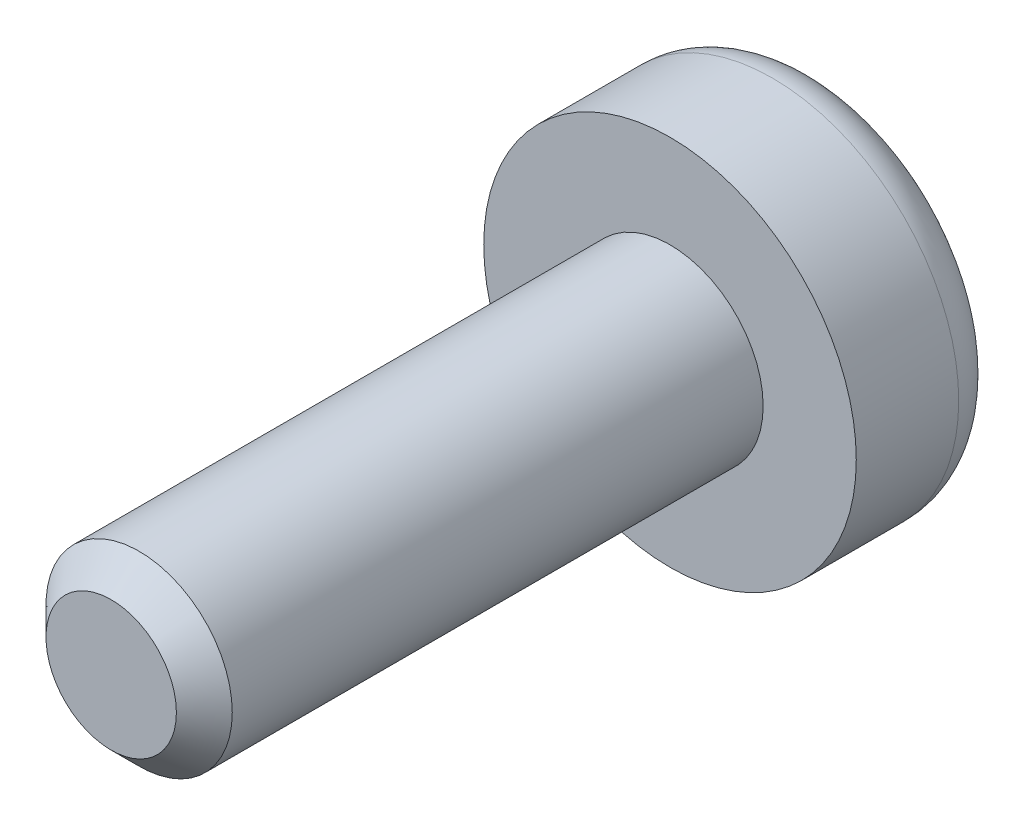
ISO-10303-21;
HEADER;
FILE_DESCRIPTION(('STEP AP214'),'2;1');
FILE_NAME('part.step','',(''),(''),'','','');
FILE_SCHEMA(('AUTOMOTIVE_DESIGN { 1 0 10303 214 1 1 1 1 }'));
ENDSEC;
DATA;
#1=APPLICATION_CONTEXT('core data for automotive mechanical design processes');
#2=APPLICATION_PROTOCOL_DEFINITION('international standard','automotive_design',2000,#1);
#3=PRODUCT_CONTEXT('',#1,'mechanical');
#4=PRODUCT('Part','Part','',(#3));
#5=PRODUCT_RELATED_PRODUCT_CATEGORY('part','',(#4));
#6=PRODUCT_DEFINITION_FORMATION('','',#4);
#7=PRODUCT_DEFINITION_CONTEXT('part definition',#1,'design');
#8=PRODUCT_DEFINITION('design','',#6,#7);
#9=PRODUCT_DEFINITION_SHAPE('','',#8);
#10=(LENGTH_UNIT() NAMED_UNIT(*) SI_UNIT(.MILLI.,.METRE.));
#11=(NAMED_UNIT(*) PLANE_ANGLE_UNIT() SI_UNIT($,.RADIAN.));
#12=(NAMED_UNIT(*) SI_UNIT($,.STERADIAN.) SOLID_ANGLE_UNIT());
#13=UNCERTAINTY_MEASURE_WITH_UNIT(LENGTH_MEASURE(1.E-05),#10,'distance_accuracy_value','');
#14=(GEOMETRIC_REPRESENTATION_CONTEXT(3) GLOBAL_UNCERTAINTY_ASSIGNED_CONTEXT((#13)) GLOBAL_UNIT_ASSIGNED_CONTEXT((#10,
#11,#12)) REPRESENTATION_CONTEXT('',''));
#15=CARTESIAN_POINT('',(0.,0.,0.));
#16=DIRECTION('',(0.,0.,1.));
#17=DIRECTION('',(1.,0.,0.));
#18=AXIS2_PLACEMENT_3D('',#15,#16,#17);
#19=CARTESIAN_POINT('',(0.,0.,1.6));
#20=DIRECTION('',(0.,0.,1.));
#21=DIRECTION('',(1.,0.,0.));
#22=AXIS2_PLACEMENT_3D('',#19,#20,#21);
#23=PLANE('',#22);
#24=CARTESIAN_POINT('',(0.,0.,1.6));
#25=DIRECTION('',(0.,0.,1.));
#26=DIRECTION('',(1.,0.,0.));
#27=AXIS2_PLACEMENT_3D('',#24,#25,#26);
#28=CIRCLE('',#27,2.);
#29=CARTESIAN_POINT('',(2.,0.,1.6));
#30=VERTEX_POINT('',#29);
#31=EDGE_CURVE('E240',#30,#30,#28,.T.);
#32=ORIENTED_EDGE('',*,*,#31,.T.);
#33=EDGE_LOOP('',(#32));
#34=FACE_BOUND('',#33,.T.);
#35=CARTESIAN_POINT('',(0.,0.,1.6));
#36=DIRECTION('',(0.,0.,1.));
#37=DIRECTION('',(1.,0.,0.));
#38=AXIS2_PLACEMENT_3D('',#35,#36,#37);
#39=CIRCLE('',#38,1.);
#40=CARTESIAN_POINT('',(1.,0.,1.6));
#41=VERTEX_POINT('',#40);
#42=EDGE_CURVE('E223',#41,#41,#39,.T.);
#43=ORIENTED_EDGE('',*,*,#42,.F.);
#44=EDGE_LOOP('',(#43));
#45=FACE_BOUND('',#44,.T.);
#46=ADVANCED_FACE('F30',(#34,#45),#23,.T.);
#47=CARTESIAN_POINT('',(0.,0.,1.6));
#48=DIRECTION('',(0.,0.,-1.));
#49=DIRECTION('',(-1.,0.,0.));
#50=AXIS2_PLACEMENT_3D('',#47,#48,#49);
#51=CYLINDRICAL_SURFACE('',#50,2.);
#52=CARTESIAN_POINT('',(0.,0.,0.5));
#53=DIRECTION('',(0.,0.,1.));
#54=DIRECTION('',(1.,0.,0.));
#55=AXIS2_PLACEMENT_3D('',#52,#53,#54);
#56=CIRCLE('',#55,2.);
#57=CARTESIAN_POINT('',(2.,0.,0.5));
#58=VERTEX_POINT('',#57);
#59=EDGE_CURVE('E38',#58,#58,#56,.T.);
#60=ORIENTED_EDGE('',*,*,#59,.T.);
#61=EDGE_LOOP('',(#60));
#62=FACE_BOUND('',#61,.T.);
#63=ORIENTED_EDGE('',*,*,#31,.F.);
#64=EDGE_LOOP('',(#63));
#65=FACE_BOUND('',#64,.T.);
#66=ADVANCED_FACE('F284',(#62,#65),#51,.T.);
#67=CARTESIAN_POINT('',(0.,0.,0.));
#68=DIRECTION('',(0.,0.,1.));
#69=DIRECTION('',(1.,0.,0.));
#70=AXIS2_PLACEMENT_3D('',#67,#68,#69);
#71=PLANE('',#70);
#72=CARTESIAN_POINT('',(0.,0.,0.));
#73=DIRECTION('',(0.,0.,1.));
#74=DIRECTION('',(1.,0.,0.));
#75=AXIS2_PLACEMENT_3D('',#72,#73,#74);
#76=CIRCLE('',#75,1.5);
#77=CARTESIAN_POINT('',(1.5,0.,0.));
#78=VERTEX_POINT('',#77);
#79=EDGE_CURVE('E11',#78,#78,#76,.F.);
#80=ORIENTED_EDGE('',*,*,#79,.T.);
#81=EDGE_LOOP('',(#80));
#82=FACE_BOUND('',#81,.T.);
#83=DIRECTION('',(0.,-1.,0.));
#84=VECTOR('',#83,1.);
#85=CARTESIAN_POINT('',(0.331458885941645,-0.280106100795731,0.));
#86=LINE('',#85,#84);
#87=CARTESIAN_POINT('',(0.331458885941645,-0.480106100795731,0.));
#88=VERTEX_POINT('',#87);
#89=CARTESIAN_POINT('',(0.331458885941645,-1.25848754269618,0.));
#90=VERTEX_POINT('',#89);
#91=EDGE_CURVE('E200',#88,#90,#86,.T.);
#92=ORIENTED_EDGE('',*,*,#91,.F.);
#93=CARTESIAN_POINT('',(0.531458885941645,-0.480106100795731,0.));
#94=DIRECTION('',(0.,0.,1.));
#95=DIRECTION('',(1.,0.,0.));
#96=AXIS2_PLACEMENT_3D('',#93,#94,#95);
#97=CIRCLE('',#96,0.2);
#98=CARTESIAN_POINT('',(0.531458885941645,-0.280106100795731,0.));
#99=VERTEX_POINT('',#98);
#100=EDGE_CURVE('E252',#88,#99,#97,.F.);
#101=ORIENTED_EDGE('',*,*,#100,.T.);
#102=DIRECTION('',(-1.,0.,0.));
#103=VECTOR('',#102,1.);
#104=CARTESIAN_POINT('',(1.34394438730288,-0.280106100795731,0.));
#105=LINE('',#104,#103);
#106=CARTESIAN_POINT('',(1.34394438730288,-0.280106100795731,0.));
#107=VERTEX_POINT('',#106);
#108=EDGE_CURVE('E197',#107,#99,#105,.T.);
#109=ORIENTED_EDGE('',*,*,#108,.F.);
#110=DIRECTION('',(0.,-1.,0.));
#111=VECTOR('',#110,1.);
#112=CARTESIAN_POINT('',(1.34394438730288,0.382811671087559,0.));
#113=LINE('',#112,#111);
#114=CARTESIAN_POINT('',(1.34394438730288,0.382811671087559,0.));
#115=VERTEX_POINT('',#114);
#116=EDGE_CURVE('E195',#115,#107,#113,.T.);
#117=ORIENTED_EDGE('',*,*,#116,.F.);
#118=DIRECTION('',(1.,0.,0.));
#119=VECTOR('',#118,1.);
#120=CARTESIAN_POINT('',(1.34394438730288,0.382811671087559,0.));
#121=LINE('',#120,#119);
#122=CARTESIAN_POINT('',(0.531458885941645,0.382811671087559,0.));
#123=VERTEX_POINT('',#122);
#124=EDGE_CURVE('E158',#123,#115,#121,.T.);
#125=ORIENTED_EDGE('',*,*,#124,.F.);
#126=CARTESIAN_POINT('',(0.531458885941645,0.582811671087559,0.));
#127=DIRECTION('',(0.,0.,1.));
#128=DIRECTION('',(1.,0.,0.));
#129=AXIS2_PLACEMENT_3D('',#126,#127,#128);
#130=CIRCLE('',#129,0.2);
#131=CARTESIAN_POINT('',(0.331458885941645,0.582811671087559,0.));
#132=VERTEX_POINT('',#131);
#133=EDGE_CURVE('E246',#123,#132,#130,.F.);
#134=ORIENTED_EDGE('',*,*,#133,.T.);
#135=DIRECTION('',(0.,-1.,0.));
#136=VECTOR('',#135,1.);
#137=CARTESIAN_POINT('',(0.331458885941645,1.38938644807031,0.));
#138=LINE('',#137,#136);
#139=CARTESIAN_POINT('',(0.331458885941645,1.38938644807031,0.));
#140=VERTEX_POINT('',#139);
#141=EDGE_CURVE('E192',#140,#132,#138,.T.);
#142=ORIENTED_EDGE('',*,*,#141,.F.);
#143=DIRECTION('',(1.,0.,0.));
#144=VECTOR('',#143,1.);
#145=CARTESIAN_POINT('',(0.331458885941645,1.38938644807031,0.));
#146=LINE('',#145,#144);
#147=CARTESIAN_POINT('',(-0.30344827586207,1.38938644807031,0.));
#148=VERTEX_POINT('',#147);
#149=EDGE_CURVE('E218',#148,#140,#146,.T.);
#150=ORIENTED_EDGE('',*,*,#149,.F.);
#151=DIRECTION('',(0.,1.,0.));
#152=VECTOR('',#151,1.);
#153=CARTESIAN_POINT('',(-0.30344827586207,1.38938644807031,0.));
#154=LINE('',#153,#152);
#155=CARTESIAN_POINT('',(-0.30344827586207,0.582811671087559,0.));
#156=VERTEX_POINT('',#155);
#157=EDGE_CURVE('E216',#156,#148,#154,.T.);
#158=ORIENTED_EDGE('',*,*,#157,.F.);
#159=CARTESIAN_POINT('',(-0.50344827586207,0.582811671087559,0.));
#160=DIRECTION('',(0.,0.,1.));
#161=DIRECTION('',(1.,0.,0.));
#162=AXIS2_PLACEMENT_3D('',#159,#160,#161);
#163=CIRCLE('',#162,0.2);
#164=CARTESIAN_POINT('',(-0.50344827586207,0.382811671087559,0.));
#165=VERTEX_POINT('',#164);
#166=EDGE_CURVE('E248',#156,#165,#163,.F.);
#167=ORIENTED_EDGE('',*,*,#166,.T.);
#168=DIRECTION('',(1.,0.,0.));
#169=VECTOR('',#168,1.);
#170=CARTESIAN_POINT('',(-0.30344827586207,0.382811671087559,0.));
#171=LINE('',#170,#169);
#172=CARTESIAN_POINT('',(-1.28525903284355,0.382811671087559,0.));
#173=VERTEX_POINT('',#172);
#174=EDGE_CURVE('E213',#173,#165,#171,.T.);
#175=ORIENTED_EDGE('',*,*,#174,.F.);
#176=DIRECTION('',(0.,1.,0.));
#177=VECTOR('',#176,1.);
#178=CARTESIAN_POINT('',(-1.28525903284355,0.382811671087559,0.));
#179=LINE('',#178,#177);
#180=CARTESIAN_POINT('',(-1.28525903284355,-0.280106100795731,0.));
#181=VERTEX_POINT('',#180);
#182=EDGE_CURVE('E210',#181,#173,#179,.T.);
#183=ORIENTED_EDGE('',*,*,#182,.F.);
#184=DIRECTION('',(-1.,0.,0.));
#185=VECTOR('',#184,1.);
#186=CARTESIAN_POINT('',(-0.30344827586207,-0.280106100795731,0.));
#187=LINE('',#186,#185);
#188=CARTESIAN_POINT('',(-0.50344827586207,-0.280106100795731,0.));
#189=VERTEX_POINT('',#188);
#190=EDGE_CURVE('E208',#189,#181,#187,.T.);
#191=ORIENTED_EDGE('',*,*,#190,.F.);
#192=CARTESIAN_POINT('',(-0.50344827586207,-0.480106100795731,0.));
#193=DIRECTION('',(0.,0.,1.));
#194=DIRECTION('',(1.,0.,0.));
#195=AXIS2_PLACEMENT_3D('',#192,#193,#194);
#196=CIRCLE('',#195,0.2);
#197=CARTESIAN_POINT('',(-0.30344827586207,-0.480106100795731,0.));
#198=VERTEX_POINT('',#197);
#199=EDGE_CURVE('E250',#189,#198,#196,.F.);
#200=ORIENTED_EDGE('',*,*,#199,.T.);
#201=DIRECTION('',(0.,1.,0.));
#202=VECTOR('',#201,1.);
#203=CARTESIAN_POINT('',(-0.30344827586207,-0.280106100795731,0.));
#204=LINE('',#203,#202);
#205=CARTESIAN_POINT('',(-0.30344827586207,-1.25848754269618,0.));
#206=VERTEX_POINT('',#205);
#207=EDGE_CURVE('E205',#206,#198,#204,.T.);
#208=ORIENTED_EDGE('',*,*,#207,.F.);
#209=DIRECTION('',(-1.,0.,0.));
#210=VECTOR('',#209,1.);
#211=CARTESIAN_POINT('',(0.331458885941645,-1.25848754269618,0.));
#212=LINE('',#211,#210);
#213=EDGE_CURVE('E202',#90,#206,#212,.T.);
#214=ORIENTED_EDGE('',*,*,#213,.F.);
#215=EDGE_LOOP('',(#92,#101,#109,#117,#125,#134,#142,#150,#158,#167,#175,#183,#191,#200,#208,#214));
#216=FACE_BOUND('',#215,.T.);
#217=ADVANCED_FACE('F302',(#82,#216),#71,.F.);
#218=CARTESIAN_POINT('',(0.,0.,7.6));
#219=DIRECTION('',(0.,0.,-1.));
#220=DIRECTION('',(-1.,0.,0.));
#221=AXIS2_PLACEMENT_3D('',#218,#219,#220);
#222=CYLINDRICAL_SURFACE('',#221,1.);
#223=CARTESIAN_POINT('',(0.,0.,7.3));
#224=DIRECTION('',(0.,0.,1.));
#225=DIRECTION('',(1.,0.,0.));
#226=AXIS2_PLACEMENT_3D('',#223,#224,#225);
#227=CIRCLE('',#226,1.);
#228=CARTESIAN_POINT('',(1.,0.,7.3));
#229=VERTEX_POINT('',#228);
#230=EDGE_CURVE('E279',#229,#229,#227,.F.);
#231=ORIENTED_EDGE('',*,*,#230,.T.);
#232=EDGE_LOOP('',(#231));
#233=FACE_BOUND('',#232,.T.);
#234=ORIENTED_EDGE('',*,*,#42,.T.);
#235=EDGE_LOOP('',(#234));
#236=FACE_BOUND('',#235,.T.);
#237=ADVANCED_FACE('F307',(#233,#236),#222,.T.);
#238=CARTESIAN_POINT('',(0.,0.,7.6));
#239=DIRECTION('',(0.,0.,1.));
#240=DIRECTION('',(1.,0.,0.));
#241=AXIS2_PLACEMENT_3D('',#238,#239,#240);
#242=PLANE('',#241);
#243=CARTESIAN_POINT('',(0.,0.,7.6));
#244=DIRECTION('',(0.,0.,1.));
#245=DIRECTION('',(1.,0.,0.));
#246=AXIS2_PLACEMENT_3D('',#243,#244,#245);
#247=CIRCLE('',#246,0.700000000000001);
#248=CARTESIAN_POINT('',(0.700000000000001,0.,7.6));
#249=VERTEX_POINT('',#248);
#250=EDGE_CURVE('E276',#249,#249,#247,.T.);
#251=ORIENTED_EDGE('',*,*,#250,.T.);
#252=EDGE_LOOP('',(#251));
#253=FACE_BOUND('',#252,.T.);
#254=ADVANCED_FACE('F377',(#253),#242,.T.);
#255=CARTESIAN_POINT('',(0.331458885941645,1.38938644807031,0.5));
#256=DIRECTION('',(1.,0.,0.));
#257=DIRECTION('',(0.,0.,-1.));
#258=AXIS2_PLACEMENT_3D('',#255,#256,#257);
#259=PLANE('',#258);
#260=ORIENTED_EDGE('',*,*,#141,.T.);
#261=DIRECTION('',(0.,0.,-1.));
#262=VECTOR('',#261,1.);
#263=CARTESIAN_POINT('',(0.331458885941645,0.582811671087559,0.5));
#264=LINE('',#263,#262);
#265=CARTESIAN_POINT('',(0.331458885941645,0.582811671087559,0.5));
#266=VERTEX_POINT('',#265);
#267=EDGE_CURVE('E45',#132,#266,#264,.F.);
#268=ORIENTED_EDGE('',*,*,#267,.T.);
#269=DIRECTION('',(0.,-1.,0.));
#270=VECTOR('',#269,1.);
#271=CARTESIAN_POINT('',(0.331458885941645,1.38938644807031,0.5));
#272=LINE('',#271,#270);
#273=CARTESIAN_POINT('',(0.331458885941645,1.38938644807031,0.5));
#274=VERTEX_POINT('',#273);
#275=EDGE_CURVE('E152',#274,#266,#272,.T.);
#276=ORIENTED_EDGE('',*,*,#275,.F.);
#277=DIRECTION('',(0.,0.,-1.));
#278=VECTOR('',#277,1.);
#279=CARTESIAN_POINT('',(0.331458885941645,1.38938644807031,0.5));
#280=LINE('',#279,#278);
#281=EDGE_CURVE('E221',#274,#140,#280,.T.);
#282=ORIENTED_EDGE('',*,*,#281,.T.);
#283=EDGE_LOOP('',(#260,#268,#276,#282));
#284=FACE_BOUND('',#283,.T.);
#285=ADVANCED_FACE('F375',(#284),#259,.F.);
#286=CARTESIAN_POINT('',(0.331458885941645,1.38938644807031,0.5));
#287=DIRECTION('',(0.,1.,0.));
#288=DIRECTION('',(0.,0.,1.));
#289=AXIS2_PLACEMENT_3D('',#286,#287,#288);
#290=PLANE('',#289);
#291=ORIENTED_EDGE('',*,*,#149,.T.);
#292=ORIENTED_EDGE('',*,*,#281,.F.);
#293=DIRECTION('',(1.,0.,0.));
#294=VECTOR('',#293,1.);
#295=CARTESIAN_POINT('',(0.331458885941645,1.38938644807031,0.5));
#296=LINE('',#295,#294);
#297=CARTESIAN_POINT('',(-0.30344827586207,1.38938644807031,0.5));
#298=VERTEX_POINT('',#297);
#299=EDGE_CURVE('E163',#298,#274,#296,.T.);
#300=ORIENTED_EDGE('',*,*,#299,.F.);
#301=DIRECTION('',(0.,0.,-1.));
#302=VECTOR('',#301,1.);
#303=CARTESIAN_POINT('',(-0.30344827586207,1.38938644807031,0.5));
#304=LINE('',#303,#302);
#305=EDGE_CURVE('E224',#298,#148,#304,.T.);
#306=ORIENTED_EDGE('',*,*,#305,.T.);
#307=EDGE_LOOP('',(#291,#292,#300,#306));
#308=FACE_BOUND('',#307,.T.);
#309=ADVANCED_FACE('F373',(#308),#290,.F.);
#310=CARTESIAN_POINT('',(-0.30344827586207,1.38938644807031,0.5));
#311=DIRECTION('',(-1.,0.,0.));
#312=DIRECTION('',(0.,0.,1.));
#313=AXIS2_PLACEMENT_3D('',#310,#311,#312);
#314=PLANE('',#313);
#315=DIRECTION('',(0.,1.,0.));
#316=VECTOR('',#315,1.);
#317=CARTESIAN_POINT('',(-0.30344827586207,1.38938644807031,0.5));
#318=LINE('',#317,#316);
#319=CARTESIAN_POINT('',(-0.30344827586207,0.582811671087559,0.5));
#320=VERTEX_POINT('',#319);
#321=EDGE_CURVE('E188',#320,#298,#318,.T.);
#322=ORIENTED_EDGE('',*,*,#321,.F.);
#323=DIRECTION('',(0.,0.,-1.));
#324=VECTOR('',#323,1.);
#325=CARTESIAN_POINT('',(-0.30344827586207,0.582811671087559,0.5));
#326=LINE('',#325,#324);
#327=EDGE_CURVE('E261',#320,#156,#326,.T.);
#328=ORIENTED_EDGE('',*,*,#327,.T.);
#329=ORIENTED_EDGE('',*,*,#157,.T.);
#330=ORIENTED_EDGE('',*,*,#305,.F.);
#331=EDGE_LOOP('',(#322,#328,#329,#330));
#332=FACE_BOUND('',#331,.T.);
#333=ADVANCED_FACE('F369',(#332),#314,.F.);
#334=CARTESIAN_POINT('',(-0.30344827586207,0.382811671087559,0.5));
#335=DIRECTION('',(0.,1.,0.));
#336=DIRECTION('',(-1.,0.,0.));
#337=AXIS2_PLACEMENT_3D('',#334,#335,#336);
#338=PLANE('',#337);
#339=ORIENTED_EDGE('',*,*,#174,.T.);
#340=DIRECTION('',(0.,0.,-1.));
#341=VECTOR('',#340,1.);
#342=CARTESIAN_POINT('',(-0.50344827586207,0.382811671087559,0.5));
#343=LINE('',#342,#341);
#344=CARTESIAN_POINT('',(-0.50344827586207,0.382811671087559,0.5));
#345=VERTEX_POINT('',#344);
#346=EDGE_CURVE('E264',#165,#345,#343,.F.);
#347=ORIENTED_EDGE('',*,*,#346,.T.);
#348=DIRECTION('',(1.,0.,0.));
#349=VECTOR('',#348,1.);
#350=CARTESIAN_POINT('',(-0.30344827586207,0.382811671087559,0.5));
#351=LINE('',#350,#349);
#352=CARTESIAN_POINT('',(-1.28525903284355,0.382811671087559,0.5));
#353=VERTEX_POINT('',#352);
#354=EDGE_CURVE('E185',#353,#345,#351,.T.);
#355=ORIENTED_EDGE('',*,*,#354,.F.);
#356=DIRECTION('',(0.,0.,-1.));
#357=VECTOR('',#356,1.);
#358=CARTESIAN_POINT('',(-1.28525903284355,0.382811671087559,0.5));
#359=LINE('',#358,#357);
#360=EDGE_CURVE('E227',#353,#173,#359,.T.);
#361=ORIENTED_EDGE('',*,*,#360,.T.);
#362=EDGE_LOOP('',(#339,#347,#355,#361));
#363=FACE_BOUND('',#362,.T.);
#364=ADVANCED_FACE('F403',(#363),#338,.F.);
#365=CARTESIAN_POINT('',(-1.28525903284355,0.382811671087559,0.5));
#366=DIRECTION('',(-1.,0.,0.));
#367=DIRECTION('',(0.,0.,1.));
#368=AXIS2_PLACEMENT_3D('',#365,#366,#367);
#369=PLANE('',#368);
#370=ORIENTED_EDGE('',*,*,#182,.T.);
#371=ORIENTED_EDGE('',*,*,#360,.F.);
#372=DIRECTION('',(0.,1.,0.));
#373=VECTOR('',#372,1.);
#374=CARTESIAN_POINT('',(-1.28525903284355,0.382811671087559,0.5));
#375=LINE('',#374,#373);
#376=CARTESIAN_POINT('',(-1.28525903284355,-0.280106100795731,0.5));
#377=VERTEX_POINT('',#376);
#378=EDGE_CURVE('E182',#377,#353,#375,.T.);
#379=ORIENTED_EDGE('',*,*,#378,.F.);
#380=DIRECTION('',(0.,0.,-1.));
#381=VECTOR('',#380,1.);
#382=CARTESIAN_POINT('',(-1.28525903284355,-0.280106100795731,0.5));
#383=LINE('',#382,#381);
#384=EDGE_CURVE('E229',#377,#181,#383,.T.);
#385=ORIENTED_EDGE('',*,*,#384,.T.);
#386=EDGE_LOOP('',(#370,#371,#379,#385));
#387=FACE_BOUND('',#386,.T.);
#388=ADVANCED_FACE('F359',(#387),#369,.F.);
#389=CARTESIAN_POINT('',(-0.30344827586207,-0.280106100795731,0.5));
#390=DIRECTION('',(0.,-1.,0.));
#391=DIRECTION('',(1.,0.,0.));
#392=AXIS2_PLACEMENT_3D('',#389,#390,#391);
#393=PLANE('',#392);
#394=DIRECTION('',(-1.,0.,0.));
#395=VECTOR('',#394,1.);
#396=CARTESIAN_POINT('',(-0.30344827586207,-0.280106100795731,0.5));
#397=LINE('',#396,#395);
#398=CARTESIAN_POINT('',(-0.50344827586207,-0.280106100795731,0.5));
#399=VERTEX_POINT('',#398);
#400=EDGE_CURVE('E180',#399,#377,#397,.T.);
#401=ORIENTED_EDGE('',*,*,#400,.F.);
#402=DIRECTION('',(0.,0.,-1.));
#403=VECTOR('',#402,1.);
#404=CARTESIAN_POINT('',(-0.50344827586207,-0.280106100795731,0.5));
#405=LINE('',#404,#403);
#406=EDGE_CURVE('E256',#399,#189,#405,.T.);
#407=ORIENTED_EDGE('',*,*,#406,.T.);
#408=ORIENTED_EDGE('',*,*,#190,.T.);
#409=ORIENTED_EDGE('',*,*,#384,.F.);
#410=EDGE_LOOP('',(#401,#407,#408,#409));
#411=FACE_BOUND('',#410,.T.);
#412=ADVANCED_FACE('F353',(#411),#393,.F.);
#413=CARTESIAN_POINT('',(-0.30344827586207,-0.280106100795731,0.5));
#414=DIRECTION('',(-1.,0.,0.));
#415=DIRECTION('',(0.,-1.,0.));
#416=AXIS2_PLACEMENT_3D('',#413,#414,#415);
#417=PLANE('',#416);
#418=ORIENTED_EDGE('',*,*,#207,.T.);
#419=DIRECTION('',(0.,0.,-1.));
#420=VECTOR('',#419,1.);
#421=CARTESIAN_POINT('',(-0.30344827586207,-0.480106100795731,0.5));
#422=LINE('',#421,#420);
#423=CARTESIAN_POINT('',(-0.30344827586207,-0.480106100795731,0.5));
#424=VERTEX_POINT('',#423);
#425=EDGE_CURVE('E259',#198,#424,#422,.F.);
#426=ORIENTED_EDGE('',*,*,#425,.T.);
#427=DIRECTION('',(0.,1.,0.));
#428=VECTOR('',#427,1.);
#429=CARTESIAN_POINT('',(-0.30344827586207,-0.280106100795731,0.5));
#430=LINE('',#429,#428);
#431=CARTESIAN_POINT('',(-0.30344827586207,-1.25848754269618,0.5));
#432=VERTEX_POINT('',#431);
#433=EDGE_CURVE('E177',#432,#424,#430,.T.);
#434=ORIENTED_EDGE('',*,*,#433,.F.);
#435=DIRECTION('',(0.,0.,-1.));
#436=VECTOR('',#435,1.);
#437=CARTESIAN_POINT('',(-0.30344827586207,-1.25848754269618,0.5));
#438=LINE('',#437,#436);
#439=EDGE_CURVE('E232',#432,#206,#438,.T.);
#440=ORIENTED_EDGE('',*,*,#439,.T.);
#441=EDGE_LOOP('',(#418,#426,#434,#440));
#442=FACE_BOUND('',#441,.T.);
#443=ADVANCED_FACE('F396',(#442),#417,.F.);
#444=CARTESIAN_POINT('',(0.331458885941645,-1.25848754269618,0.5));
#445=DIRECTION('',(0.,-1.,0.));
#446=DIRECTION('',(0.,0.,-1.));
#447=AXIS2_PLACEMENT_3D('',#444,#445,#446);
#448=PLANE('',#447);
#449=ORIENTED_EDGE('',*,*,#213,.T.);
#450=ORIENTED_EDGE('',*,*,#439,.F.);
#451=DIRECTION('',(-1.,0.,0.));
#452=VECTOR('',#451,1.);
#453=CARTESIAN_POINT('',(0.331458885941645,-1.25848754269618,0.5));
#454=LINE('',#453,#452);
#455=CARTESIAN_POINT('',(0.331458885941645,-1.25848754269618,0.5));
#456=VERTEX_POINT('',#455);
#457=EDGE_CURVE('E174',#456,#432,#454,.T.);
#458=ORIENTED_EDGE('',*,*,#457,.F.);
#459=DIRECTION('',(0.,0.,-1.));
#460=VECTOR('',#459,1.);
#461=CARTESIAN_POINT('',(0.331458885941645,-1.25848754269618,0.5));
#462=LINE('',#461,#460);
#463=EDGE_CURVE('E234',#456,#90,#462,.T.);
#464=ORIENTED_EDGE('',*,*,#463,.T.);
#465=EDGE_LOOP('',(#449,#450,#458,#464));
#466=FACE_BOUND('',#465,.T.);
#467=ADVANCED_FACE('F344',(#466),#448,.F.);
#468=CARTESIAN_POINT('',(0.331458885941645,-0.280106100795731,0.5));
#469=DIRECTION('',(1.,0.,0.));
#470=DIRECTION('',(0.,0.,-1.));
#471=AXIS2_PLACEMENT_3D('',#468,#469,#470);
#472=PLANE('',#471);
#473=DIRECTION('',(0.,-1.,0.));
#474=VECTOR('',#473,1.);
#475=CARTESIAN_POINT('',(0.331458885941645,-0.280106100795731,0.5));
#476=LINE('',#475,#474);
#477=CARTESIAN_POINT('',(0.331458885941645,-0.480106100795731,0.5));
#478=VERTEX_POINT('',#477);
#479=EDGE_CURVE('E169',#478,#456,#476,.T.);
#480=ORIENTED_EDGE('',*,*,#479,.F.);
#481=DIRECTION('',(0.,0.,-1.));
#482=VECTOR('',#481,1.);
#483=CARTESIAN_POINT('',(0.331458885941645,-0.480106100795731,0.5));
#484=LINE('',#483,#482);
#485=EDGE_CURVE('E243',#478,#88,#484,.T.);
#486=ORIENTED_EDGE('',*,*,#485,.T.);
#487=ORIENTED_EDGE('',*,*,#91,.T.);
#488=ORIENTED_EDGE('',*,*,#463,.F.);
#489=EDGE_LOOP('',(#480,#486,#487,#488));
#490=FACE_BOUND('',#489,.T.);
#491=ADVANCED_FACE('F340',(#490),#472,.F.);
#492=CARTESIAN_POINT('',(1.34394438730288,-0.280106100795731,0.5));
#493=DIRECTION('',(0.,-1.,0.));
#494=DIRECTION('',(1.,0.,0.));
#495=AXIS2_PLACEMENT_3D('',#492,#493,#494);
#496=PLANE('',#495);
#497=ORIENTED_EDGE('',*,*,#108,.T.);
#498=DIRECTION('',(0.,0.,-1.));
#499=VECTOR('',#498,1.);
#500=CARTESIAN_POINT('',(0.531458885941645,-0.280106100795731,0.5));
#501=LINE('',#500,#499);
#502=CARTESIAN_POINT('',(0.531458885941645,-0.280106100795731,0.5));
#503=VERTEX_POINT('',#502);
#504=EDGE_CURVE('E254',#99,#503,#501,.F.);
#505=ORIENTED_EDGE('',*,*,#504,.T.);
#506=DIRECTION('',(-1.,0.,0.));
#507=VECTOR('',#506,1.);
#508=CARTESIAN_POINT('',(1.34394438730288,-0.280106100795731,0.5));
#509=LINE('',#508,#507);
#510=CARTESIAN_POINT('',(1.34394438730288,-0.280106100795731,0.5));
#511=VERTEX_POINT('',#510);
#512=EDGE_CURVE('E167',#511,#503,#509,.T.);
#513=ORIENTED_EDGE('',*,*,#512,.F.);
#514=DIRECTION('',(0.,0.,-1.));
#515=VECTOR('',#514,1.);
#516=CARTESIAN_POINT('',(1.34394438730288,-0.280106100795731,0.5));
#517=LINE('',#516,#515);
#518=EDGE_CURVE('E162',#511,#107,#517,.T.);
#519=ORIENTED_EDGE('',*,*,#518,.T.);
#520=EDGE_LOOP('',(#497,#505,#513,#519));
#521=FACE_BOUND('',#520,.T.);
#522=ADVANCED_FACE('F334',(#521),#496,.F.);
#523=CARTESIAN_POINT('',(1.34394438730288,0.382811671087559,0.5));
#524=DIRECTION('',(1.,0.,0.));
#525=DIRECTION('',(0.,0.,-1.));
#526=AXIS2_PLACEMENT_3D('',#523,#524,#525);
#527=PLANE('',#526);
#528=ORIENTED_EDGE('',*,*,#116,.T.);
#529=ORIENTED_EDGE('',*,*,#518,.F.);
#530=DIRECTION('',(0.,-1.,0.));
#531=VECTOR('',#530,1.);
#532=CARTESIAN_POINT('',(1.34394438730288,0.382811671087559,0.5));
#533=LINE('',#532,#531);
#534=CARTESIAN_POINT('',(1.34394438730288,0.382811671087559,0.5));
#535=VERTEX_POINT('',#534);
#536=EDGE_CURVE('E148',#535,#511,#533,.T.);
#537=ORIENTED_EDGE('',*,*,#536,.F.);
#538=DIRECTION('',(0.,0.,-1.));
#539=VECTOR('',#538,1.);
#540=CARTESIAN_POINT('',(1.34394438730288,0.382811671087559,0.5));
#541=LINE('',#540,#539);
#542=EDGE_CURVE('E155',#535,#115,#541,.T.);
#543=ORIENTED_EDGE('',*,*,#542,.T.);
#544=EDGE_LOOP('',(#528,#529,#537,#543));
#545=FACE_BOUND('',#544,.T.);
#546=ADVANCED_FACE('F165',(#545),#527,.F.);
#547=CARTESIAN_POINT('',(1.34394438730288,0.382811671087559,0.5));
#548=DIRECTION('',(0.,1.,0.));
#549=DIRECTION('',(-1.,0.,0.));
#550=AXIS2_PLACEMENT_3D('',#547,#548,#549);
#551=PLANE('',#550);
#552=DIRECTION('',(1.,0.,0.));
#553=VECTOR('',#552,1.);
#554=CARTESIAN_POINT('',(1.34394438730288,0.382811671087559,0.5));
#555=LINE('',#554,#553);
#556=CARTESIAN_POINT('',(0.531458885941645,0.382811671087559,0.5));
#557=VERTEX_POINT('',#556);
#558=EDGE_CURVE('E143',#557,#535,#555,.T.);
#559=ORIENTED_EDGE('',*,*,#558,.F.);
#560=DIRECTION('',(0.,0.,-1.));
#561=VECTOR('',#560,1.);
#562=CARTESIAN_POINT('',(0.531458885941645,0.382811671087559,0.5));
#563=LINE('',#562,#561);
#564=EDGE_CURVE('E266',#557,#123,#563,.T.);
#565=ORIENTED_EDGE('',*,*,#564,.T.);
#566=ORIENTED_EDGE('',*,*,#124,.T.);
#567=ORIENTED_EDGE('',*,*,#542,.F.);
#568=EDGE_LOOP('',(#559,#565,#566,#567));
#569=FACE_BOUND('',#568,.T.);
#570=ADVANCED_FACE('F156',(#569),#551,.F.);
#571=CARTESIAN_POINT('',(0.331458885941645,-1.25848754269618,0.5));
#572=DIRECTION('',(0.,0.,-1.));
#573=DIRECTION('',(-1.,0.,0.));
#574=AXIS2_PLACEMENT_3D('',#571,#572,#573);
#575=PLANE('',#574);
#576=ORIENTED_EDGE('',*,*,#275,.T.);
#577=CARTESIAN_POINT('',(0.531458885941645,0.582811671087559,0.5));
#578=DIRECTION('',(0.,0.,-1.));
#579=DIRECTION('',(-1.,0.,0.));
#580=AXIS2_PLACEMENT_3D('',#577,#578,#579);
#581=CIRCLE('',#580,0.2);
#582=EDGE_CURVE('E52',#266,#557,#581,.F.);
#583=ORIENTED_EDGE('',*,*,#582,.T.);
#584=ORIENTED_EDGE('',*,*,#558,.T.);
#585=ORIENTED_EDGE('',*,*,#536,.T.);
#586=ORIENTED_EDGE('',*,*,#512,.T.);
#587=CARTESIAN_POINT('',(0.531458885941645,-0.480106100795731,0.5));
#588=DIRECTION('',(0.,0.,-1.));
#589=DIRECTION('',(-1.,0.,0.));
#590=AXIS2_PLACEMENT_3D('',#587,#588,#589);
#591=CIRCLE('',#590,0.2);
#592=EDGE_CURVE('E269',#503,#478,#591,.F.);
#593=ORIENTED_EDGE('',*,*,#592,.T.);
#594=ORIENTED_EDGE('',*,*,#479,.T.);
#595=ORIENTED_EDGE('',*,*,#457,.T.);
#596=ORIENTED_EDGE('',*,*,#433,.T.);
#597=CARTESIAN_POINT('',(-0.50344827586207,-0.480106100795731,0.5));
#598=DIRECTION('',(0.,0.,-1.));
#599=DIRECTION('',(-1.,0.,0.));
#600=AXIS2_PLACEMENT_3D('',#597,#598,#599);
#601=CIRCLE('',#600,0.2);
#602=EDGE_CURVE('E271',#424,#399,#601,.F.);
#603=ORIENTED_EDGE('',*,*,#602,.T.);
#604=ORIENTED_EDGE('',*,*,#400,.T.);
#605=ORIENTED_EDGE('',*,*,#378,.T.);
#606=ORIENTED_EDGE('',*,*,#354,.T.);
#607=CARTESIAN_POINT('',(-0.50344827586207,0.582811671087559,0.5));
#608=DIRECTION('',(0.,0.,-1.));
#609=DIRECTION('',(-1.,0.,0.));
#610=AXIS2_PLACEMENT_3D('',#607,#608,#609);
#611=CIRCLE('',#610,0.2);
#612=EDGE_CURVE('E273',#345,#320,#611,.F.);
#613=ORIENTED_EDGE('',*,*,#612,.T.);
#614=ORIENTED_EDGE('',*,*,#321,.T.);
#615=ORIENTED_EDGE('',*,*,#299,.T.);
#616=EDGE_LOOP('',(#576,#583,#584,#585,#586,#593,#594,#595,#596,#603,#604,#605,#606,#613,#614,#615));
#617=FACE_BOUND('',#616,.T.);
#618=ADVANCED_FACE('F145',(#617),#575,.T.);
#619=CARTESIAN_POINT('',(0.531458885941645,-0.480106100795731,0.5));
#620=DIRECTION('',(0.,0.,-1.));
#621=DIRECTION('',(-1.,0.,0.));
#622=AXIS2_PLACEMENT_3D('',#619,#620,#621);
#623=CYLINDRICAL_SURFACE('',#622,0.2);
#624=ORIENTED_EDGE('',*,*,#592,.F.);
#625=ORIENTED_EDGE('',*,*,#504,.F.);
#626=ORIENTED_EDGE('',*,*,#100,.F.);
#627=ORIENTED_EDGE('',*,*,#485,.F.);
#628=EDGE_LOOP('',(#624,#625,#626,#627));
#629=FACE_BOUND('',#628,.T.);
#630=ADVANCED_FACE('F312',(#629),#623,.T.);
#631=CARTESIAN_POINT('',(-0.50344827586207,-0.480106100795731,0.5));
#632=DIRECTION('',(0.,0.,-1.));
#633=DIRECTION('',(-1.,0.,0.));
#634=AXIS2_PLACEMENT_3D('',#631,#632,#633);
#635=CYLINDRICAL_SURFACE('',#634,0.2);
#636=ORIENTED_EDGE('',*,*,#602,.F.);
#637=ORIENTED_EDGE('',*,*,#425,.F.);
#638=ORIENTED_EDGE('',*,*,#199,.F.);
#639=ORIENTED_EDGE('',*,*,#406,.F.);
#640=EDGE_LOOP('',(#636,#637,#638,#639));
#641=FACE_BOUND('',#640,.T.);
#642=ADVANCED_FACE('F315',(#641),#635,.T.);
#643=CARTESIAN_POINT('',(-0.50344827586207,0.582811671087559,0.5));
#644=DIRECTION('',(0.,0.,-1.));
#645=DIRECTION('',(-1.,0.,0.));
#646=AXIS2_PLACEMENT_3D('',#643,#644,#645);
#647=CYLINDRICAL_SURFACE('',#646,0.2);
#648=ORIENTED_EDGE('',*,*,#612,.F.);
#649=ORIENTED_EDGE('',*,*,#346,.F.);
#650=ORIENTED_EDGE('',*,*,#166,.F.);
#651=ORIENTED_EDGE('',*,*,#327,.F.);
#652=EDGE_LOOP('',(#648,#649,#650,#651));
#653=FACE_BOUND('',#652,.T.);
#654=ADVANCED_FACE('F319',(#653),#647,.T.);
#655=CARTESIAN_POINT('',(0.531458885941645,0.582811671087559,0.5));
#656=DIRECTION('',(0.,0.,-1.));
#657=DIRECTION('',(-1.,0.,0.));
#658=AXIS2_PLACEMENT_3D('',#655,#656,#657);
#659=CYLINDRICAL_SURFACE('',#658,0.2);
#660=ORIENTED_EDGE('',*,*,#582,.F.);
#661=ORIENTED_EDGE('',*,*,#267,.F.);
#662=ORIENTED_EDGE('',*,*,#133,.F.);
#663=ORIENTED_EDGE('',*,*,#564,.F.);
#664=EDGE_LOOP('',(#660,#661,#662,#663));
#665=FACE_BOUND('',#664,.T.);
#666=ADVANCED_FACE('F293',(#665),#659,.T.);
#667=CARTESIAN_POINT('',(0.,0.,7.6));
#668=DIRECTION('',(0.,0.,-1.));
#669=DIRECTION('',(-1.,0.,0.));
#670=AXIS2_PLACEMENT_3D('',#667,#668,#669);
#671=CONICAL_SURFACE('',#670,0.700000000000001,0.785398163397447);
#672=ORIENTED_EDGE('',*,*,#230,.F.);
#673=EDGE_LOOP('',(#672));
#674=FACE_BOUND('',#673,.T.);
#675=ORIENTED_EDGE('',*,*,#250,.F.);
#676=EDGE_LOOP('',(#675));
#677=FACE_BOUND('',#676,.T.);
#678=ADVANCED_FACE('F288',(#674,#677),#671,.T.);
#679=CARTESIAN_POINT('',(0.,0.,0.5));
#680=DIRECTION('',(0.,0.,1.));
#681=DIRECTION('',(1.,0.,0.));
#682=AXIS2_PLACEMENT_3D('',#679,#680,#681);
#683=TOROIDAL_SURFACE('',#682,1.5,0.5);
#684=ORIENTED_EDGE('',*,*,#79,.F.);
#685=EDGE_LOOP('',(#684));
#686=FACE_BOUND('',#685,.T.);
#687=ORIENTED_EDGE('',*,*,#59,.F.);
#688=EDGE_LOOP('',(#687));
#689=FACE_BOUND('',#688,.T.);
#690=ADVANCED_FACE('F32',(#686,#689),#683,.T.);
#691=CLOSED_SHELL('',(#46,#66,#217,#237,#254,#285,#309,#333,#364,#388,#412,#443,#467,#491,#522,
#546,#570,#618,#630,#642,#654,#666,#678,#690));
#692=MANIFOLD_SOLID_BREP('B2',#691);
#693=ADVANCED_BREP_SHAPE_REPRESENTATION('',(#18,#692),#14);
#694=SHAPE_DEFINITION_REPRESENTATION(#9,#693);
ENDSEC;
END-ISO-10303-21;
